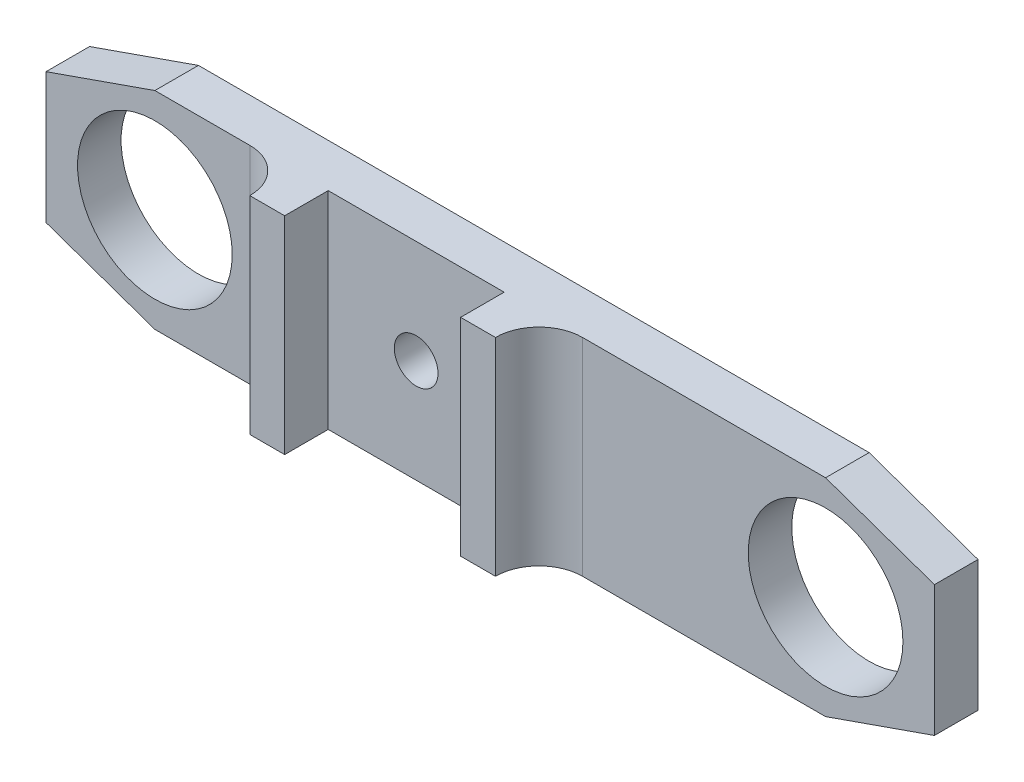
ISO-10303-21;
HEADER;
FILE_DESCRIPTION(('STEP AP214'),'2;1');
FILE_NAME('part.step','',(''),(''),'','','');
FILE_SCHEMA(('AUTOMOTIVE_DESIGN { 1 0 10303 214 1 1 1 1 }'));
ENDSEC;
DATA;
#1=APPLICATION_CONTEXT('core data for automotive mechanical design processes');
#2=APPLICATION_PROTOCOL_DEFINITION('international standard','automotive_design',2000,#1);
#3=PRODUCT_CONTEXT('',#1,'mechanical');
#4=PRODUCT('Part','Part','',(#3));
#5=PRODUCT_RELATED_PRODUCT_CATEGORY('part','',(#4));
#6=PRODUCT_DEFINITION_FORMATION('','',#4);
#7=PRODUCT_DEFINITION_CONTEXT('part definition',#1,'design');
#8=PRODUCT_DEFINITION('design','',#6,#7);
#9=PRODUCT_DEFINITION_SHAPE('','',#8);
#10=(LENGTH_UNIT() NAMED_UNIT(*) SI_UNIT(.MILLI.,.METRE.));
#11=(NAMED_UNIT(*) PLANE_ANGLE_UNIT() SI_UNIT($,.RADIAN.));
#12=(NAMED_UNIT(*) SI_UNIT($,.STERADIAN.) SOLID_ANGLE_UNIT());
#13=UNCERTAINTY_MEASURE_WITH_UNIT(LENGTH_MEASURE(1.E-05),#10,'distance_accuracy_value','');
#14=(GEOMETRIC_REPRESENTATION_CONTEXT(3) GLOBAL_UNCERTAINTY_ASSIGNED_CONTEXT((#13)) GLOBAL_UNIT_ASSIGNED_CONTEXT((#10,
#11,#12)) REPRESENTATION_CONTEXT('',''));
#15=CARTESIAN_POINT('',(0.,0.,0.));
#16=DIRECTION('',(0.,0.,1.));
#17=DIRECTION('',(1.,0.,0.));
#18=AXIS2_PLACEMENT_3D('',#15,#16,#17);
#19=CARTESIAN_POINT('',(0.,0.,6.35));
#20=DIRECTION('',(0.,0.,-1.));
#21=DIRECTION('',(-1.,0.,0.));
#22=AXIS2_PLACEMENT_3D('',#19,#20,#21);
#23=PLANE('',#22);
#24=CARTESIAN_POINT('',(0.,0.,6.35));
#25=DIRECTION('',(0.,0.,1.));
#26=DIRECTION('',(1.,0.,0.));
#27=AXIS2_PLACEMENT_3D('',#24,#25,#26);
#28=CIRCLE('',#27,3.1877);
#29=CARTESIAN_POINT('',(3.1877,0.,6.35));
#30=VERTEX_POINT('',#29);
#31=EDGE_CURVE('E258',#30,#30,#28,.T.);
#32=ORIENTED_EDGE('',*,*,#31,.F.);
#33=EDGE_LOOP('',(#32));
#34=FACE_BOUND('',#33,.T.);
#35=DIRECTION('',(0.,1.,0.));
#36=VECTOR('',#35,1.);
#37=CARTESIAN_POINT('',(-12.827,0.,6.35));
#38=LINE('',#37,#36);
#39=CARTESIAN_POINT('',(-12.827,-15.08125,6.35));
#40=VERTEX_POINT('',#39);
#41=CARTESIAN_POINT('',(-12.827,15.08125,6.35));
#42=VERTEX_POINT('',#41);
#43=EDGE_CURVE('E179',#40,#42,#38,.T.);
#44=ORIENTED_EDGE('',*,*,#43,.F.);
#45=DIRECTION('',(1.,0.,0.));
#46=VECTOR('',#45,1.);
#47=CARTESIAN_POINT('',(59.69,-15.08125,6.35));
#48=LINE('',#47,#46);
#49=CARTESIAN_POINT('',(12.827,-15.08125,6.35));
#50=VERTEX_POINT('',#49);
#51=EDGE_CURVE('E272',#40,#50,#48,.T.);
#52=ORIENTED_EDGE('',*,*,#51,.T.);
#53=DIRECTION('',(0.,1.,0.));
#54=VECTOR('',#53,1.);
#55=CARTESIAN_POINT('',(12.827,0.,6.35));
#56=LINE('',#55,#54);
#57=CARTESIAN_POINT('',(12.827,15.08125,6.35));
#58=VERTEX_POINT('',#57);
#59=EDGE_CURVE('E316',#50,#58,#56,.T.);
#60=ORIENTED_EDGE('',*,*,#59,.T.);
#61=DIRECTION('',(-1.,0.,0.));
#62=VECTOR('',#61,1.);
#63=CARTESIAN_POINT('',(-38.1,15.08125,6.35));
#64=LINE('',#63,#62);
#65=EDGE_CURVE('E259',#58,#42,#64,.T.);
#66=ORIENTED_EDGE('',*,*,#65,.T.);
#67=EDGE_LOOP('',(#44,#52,#60,#66));
#68=FACE_BOUND('',#67,.T.);
#69=ADVANCED_FACE('F44',(#34,#68),#23,.F.);
#70=CARTESIAN_POINT('',(59.69,0.,6.35));
#71=DIRECTION('',(0.,0.,1.));
#72=DIRECTION('',(1.,0.,0.));
#73=AXIS2_PLACEMENT_3D('',#70,#71,#72);
#74=CIRCLE('',#73,11.2776);
#75=CARTESIAN_POINT('',(70.9676,0.,6.35));
#76=VERTEX_POINT('',#75);
#77=EDGE_CURVE('E297',#76,#76,#74,.T.);
#78=ORIENTED_EDGE('',*,*,#77,.F.);
#79=EDGE_LOOP('',(#78));
#80=FACE_BOUND('',#79,.T.);
#81=CARTESIAN_POINT('',(59.69,15.08125,6.35));
#82=VERTEX_POINT('',#81);
#83=CARTESIAN_POINT('',(24.257,15.08125,6.35));
#84=VERTEX_POINT('',#83);
#85=EDGE_CURVE('E226',#82,#84,#64,.T.);
#86=ORIENTED_EDGE('',*,*,#85,.T.);
#87=DIRECTION('',(0.,1.,0.));
#88=VECTOR('',#87,1.);
#89=CARTESIAN_POINT('',(24.257,-15.08125,6.35));
#90=LINE('',#89,#88);
#91=CARTESIAN_POINT('',(24.257,-15.08125,6.35));
#92=VERTEX_POINT('',#91);
#93=EDGE_CURVE('E70',#84,#92,#90,.F.);
#94=ORIENTED_EDGE('',*,*,#93,.T.);
#95=CARTESIAN_POINT('',(59.69,-15.08125,6.35));
#96=VERTEX_POINT('',#95);
#97=EDGE_CURVE('E273',#92,#96,#48,.T.);
#98=ORIENTED_EDGE('',*,*,#97,.T.);
#99=DIRECTION('',(0.943858356366017,0.330350424728106,0.));
#100=VECTOR('',#99,1.);
#101=CARTESIAN_POINT('',(75.565,-9.525,6.35));
#102=LINE('',#101,#100);
#103=CARTESIAN_POINT('',(75.565,-9.525,6.35));
#104=VERTEX_POINT('',#103);
#105=EDGE_CURVE('E270',#96,#104,#102,.T.);
#106=ORIENTED_EDGE('',*,*,#105,.T.);
#107=DIRECTION('',(0.,1.,0.));
#108=VECTOR('',#107,1.);
#109=CARTESIAN_POINT('',(75.565,9.525,6.35));
#110=LINE('',#109,#108);
#111=CARTESIAN_POINT('',(75.565,9.525,6.35));
#112=VERTEX_POINT('',#111);
#113=EDGE_CURVE('E262',#104,#112,#110,.T.);
#114=ORIENTED_EDGE('',*,*,#113,.T.);
#115=DIRECTION('',(-0.943858356366017,0.330350424728106,0.));
#116=VECTOR('',#115,1.);
#117=CARTESIAN_POINT('',(59.69,15.08125,6.35));
#118=LINE('',#117,#116);
#119=EDGE_CURVE('E261',#112,#82,#118,.T.);
#120=ORIENTED_EDGE('',*,*,#119,.T.);
#121=EDGE_LOOP('',(#86,#94,#98,#106,#114,#120));
#122=FACE_BOUND('',#121,.T.);
#123=ADVANCED_FACE('F380',(#80,#122),#23,.F.);
#124=CARTESIAN_POINT('',(-38.1,-15.08125,6.35));
#125=VERTEX_POINT('',#124);
#126=CARTESIAN_POINT('',(-24.257,-15.08125,6.35));
#127=VERTEX_POINT('',#126);
#128=EDGE_CURVE('E269',#125,#127,#48,.T.);
#129=ORIENTED_EDGE('',*,*,#128,.T.);
#130=DIRECTION('',(0.,1.,0.));
#131=VECTOR('',#130,1.);
#132=CARTESIAN_POINT('',(-24.257,0.,6.35));
#133=LINE('',#132,#131);
#134=CARTESIAN_POINT('',(-24.257,15.08125,6.35));
#135=VERTEX_POINT('',#134);
#136=EDGE_CURVE('E183',#127,#135,#133,.T.);
#137=ORIENTED_EDGE('',*,*,#136,.T.);
#138=CARTESIAN_POINT('',(-38.1,15.08125,6.35));
#139=VERTEX_POINT('',#138);
#140=EDGE_CURVE('E257',#135,#139,#64,.T.);
#141=ORIENTED_EDGE('',*,*,#140,.T.);
#142=DIRECTION('',(-0.943858356366017,-0.330350424728106,0.));
#143=VECTOR('',#142,1.);
#144=CARTESIAN_POINT('',(-53.975,9.525,6.35));
#145=LINE('',#144,#143);
#146=CARTESIAN_POINT('',(-53.975,9.525,6.35));
#147=VERTEX_POINT('',#146);
#148=EDGE_CURVE('E231',#139,#147,#145,.T.);
#149=ORIENTED_EDGE('',*,*,#148,.T.);
#150=DIRECTION('',(0.,-1.,0.));
#151=VECTOR('',#150,1.);
#152=CARTESIAN_POINT('',(-53.975,-9.525,6.35));
#153=LINE('',#152,#151);
#154=CARTESIAN_POINT('',(-53.975,-9.525,6.35));
#155=VERTEX_POINT('',#154);
#156=EDGE_CURVE('E279',#147,#155,#153,.T.);
#157=ORIENTED_EDGE('',*,*,#156,.T.);
#158=DIRECTION('',(0.943858356366017,-0.330350424728106,0.));
#159=VECTOR('',#158,1.);
#160=CARTESIAN_POINT('',(-38.1,-15.08125,6.35));
#161=LINE('',#160,#159);
#162=EDGE_CURVE('E274',#155,#125,#161,.T.);
#163=ORIENTED_EDGE('',*,*,#162,.T.);
#164=EDGE_LOOP('',(#129,#137,#141,#149,#157,#163));
#165=FACE_BOUND('',#164,.T.);
#166=CARTESIAN_POINT('',(-38.1,0.,6.35));
#167=DIRECTION('',(0.,0.,1.));
#168=DIRECTION('',(1.,0.,0.));
#169=AXIS2_PLACEMENT_3D('',#166,#167,#168);
#170=CIRCLE('',#169,11.2776);
#171=CARTESIAN_POINT('',(-26.8224,0.,6.35));
#172=VERTEX_POINT('',#171);
#173=EDGE_CURVE('E286',#172,#172,#170,.T.);
#174=ORIENTED_EDGE('',*,*,#173,.F.);
#175=EDGE_LOOP('',(#174));
#176=FACE_BOUND('',#175,.T.);
#177=ADVANCED_FACE('F354',(#165,#176),#23,.F.);
#178=CARTESIAN_POINT('',(0.,0.,0.));
#179=DIRECTION('',(0.,0.,-1.));
#180=DIRECTION('',(-1.,0.,0.));
#181=AXIS2_PLACEMENT_3D('',#178,#179,#180);
#182=PLANE('',#181);
#183=CARTESIAN_POINT('',(-38.1,0.,0.));
#184=DIRECTION('',(0.,0.,1.));
#185=DIRECTION('',(1.,0.,0.));
#186=AXIS2_PLACEMENT_3D('',#183,#184,#185);
#187=CIRCLE('',#186,11.2776);
#188=CARTESIAN_POINT('',(-26.8224,0.,0.));
#189=VERTEX_POINT('',#188);
#190=EDGE_CURVE('E295',#189,#189,#187,.T.);
#191=ORIENTED_EDGE('',*,*,#190,.T.);
#192=EDGE_LOOP('',(#191));
#193=FACE_BOUND('',#192,.T.);
#194=DIRECTION('',(-0.943858356366017,-0.330350424728106,0.));
#195=VECTOR('',#194,1.);
#196=CARTESIAN_POINT('',(-53.975,9.525,0.));
#197=LINE('',#196,#195);
#198=CARTESIAN_POINT('',(-38.1,15.08125,0.));
#199=VERTEX_POINT('',#198);
#200=CARTESIAN_POINT('',(-53.975,9.525,0.));
#201=VERTEX_POINT('',#200);
#202=EDGE_CURVE('E252',#199,#201,#197,.T.);
#203=ORIENTED_EDGE('',*,*,#202,.F.);
#204=DIRECTION('',(-1.,0.,0.));
#205=VECTOR('',#204,1.);
#206=CARTESIAN_POINT('',(-38.1,15.08125,0.));
#207=LINE('',#206,#205);
#208=CARTESIAN_POINT('',(59.69,15.08125,0.));
#209=VERTEX_POINT('',#208);
#210=EDGE_CURVE('E228',#209,#199,#207,.T.);
#211=ORIENTED_EDGE('',*,*,#210,.F.);
#212=DIRECTION('',(-0.943858356366017,0.330350424728106,0.));
#213=VECTOR('',#212,1.);
#214=CARTESIAN_POINT('',(59.69,15.08125,0.));
#215=LINE('',#214,#213);
#216=CARTESIAN_POINT('',(75.565,9.525,0.));
#217=VERTEX_POINT('',#216);
#218=EDGE_CURVE('E232',#217,#209,#215,.T.);
#219=ORIENTED_EDGE('',*,*,#218,.F.);
#220=DIRECTION('',(0.,1.,0.));
#221=VECTOR('',#220,1.);
#222=CARTESIAN_POINT('',(75.565,9.525,0.));
#223=LINE('',#222,#221);
#224=CARTESIAN_POINT('',(75.565,-9.525,0.));
#225=VERTEX_POINT('',#224);
#226=EDGE_CURVE('E240',#225,#217,#223,.T.);
#227=ORIENTED_EDGE('',*,*,#226,.F.);
#228=DIRECTION('',(0.943858356366017,0.330350424728106,0.));
#229=VECTOR('',#228,1.);
#230=CARTESIAN_POINT('',(75.565,-9.525,0.));
#231=LINE('',#230,#229);
#232=CARTESIAN_POINT('',(59.69,-15.08125,0.));
#233=VERTEX_POINT('',#232);
#234=EDGE_CURVE('E238',#233,#225,#231,.T.);
#235=ORIENTED_EDGE('',*,*,#234,.F.);
#236=DIRECTION('',(1.,0.,0.));
#237=VECTOR('',#236,1.);
#238=CARTESIAN_POINT('',(59.69,-15.08125,0.));
#239=LINE('',#238,#237);
#240=CARTESIAN_POINT('',(-38.1,-15.08125,0.));
#241=VERTEX_POINT('',#240);
#242=EDGE_CURVE('E244',#241,#233,#239,.T.);
#243=ORIENTED_EDGE('',*,*,#242,.F.);
#244=DIRECTION('',(0.943858356366017,-0.330350424728106,0.));
#245=VECTOR('',#244,1.);
#246=CARTESIAN_POINT('',(-38.1,-15.08125,0.));
#247=LINE('',#246,#245);
#248=CARTESIAN_POINT('',(-53.975,-9.525,0.));
#249=VERTEX_POINT('',#248);
#250=EDGE_CURVE('E248',#249,#241,#247,.T.);
#251=ORIENTED_EDGE('',*,*,#250,.F.);
#252=DIRECTION('',(0.,-1.,0.));
#253=VECTOR('',#252,1.);
#254=CARTESIAN_POINT('',(-53.975,-9.525,0.));
#255=LINE('',#254,#253);
#256=EDGE_CURVE('E247',#201,#249,#255,.T.);
#257=ORIENTED_EDGE('',*,*,#256,.F.);
#258=EDGE_LOOP('',(#203,#211,#219,#227,#235,#243,#251,#257));
#259=FACE_BOUND('',#258,.T.);
#260=CARTESIAN_POINT('',(0.,0.,0.));
#261=DIRECTION('',(0.,0.,1.));
#262=DIRECTION('',(1.,0.,0.));
#263=AXIS2_PLACEMENT_3D('',#260,#261,#262);
#264=CIRCLE('',#263,3.1877);
#265=CARTESIAN_POINT('',(3.1877,0.,0.));
#266=VERTEX_POINT('',#265);
#267=EDGE_CURVE('E281',#266,#266,#264,.T.);
#268=ORIENTED_EDGE('',*,*,#267,.T.);
#269=EDGE_LOOP('',(#268));
#270=FACE_BOUND('',#269,.T.);
#271=CARTESIAN_POINT('',(59.69,0.,0.));
#272=DIRECTION('',(0.,0.,1.));
#273=DIRECTION('',(1.,0.,0.));
#274=AXIS2_PLACEMENT_3D('',#271,#272,#273);
#275=CIRCLE('',#274,11.2776);
#276=CARTESIAN_POINT('',(70.9676,0.,0.));
#277=VERTEX_POINT('',#276);
#278=EDGE_CURVE('E298',#277,#277,#275,.T.);
#279=ORIENTED_EDGE('',*,*,#278,.T.);
#280=EDGE_LOOP('',(#279));
#281=FACE_BOUND('',#280,.T.);
#282=ADVANCED_FACE('F365',(#193,#259,#270,#281),#182,.T.);
#283=CARTESIAN_POINT('',(-53.975,9.525,6.35));
#284=DIRECTION('',(0.330350424728106,-0.943858356366017,0.));
#285=DIRECTION('',(0.943858356366017,0.330350424728106,0.));
#286=AXIS2_PLACEMENT_3D('',#283,#284,#285);
#287=PLANE('',#286);
#288=ORIENTED_EDGE('',*,*,#202,.T.);
#289=DIRECTION('',(0.,0.,-1.));
#290=VECTOR('',#289,1.);
#291=CARTESIAN_POINT('',(-53.975,9.525,6.35));
#292=LINE('',#291,#290);
#293=EDGE_CURVE('E197',#147,#201,#292,.T.);
#294=ORIENTED_EDGE('',*,*,#293,.F.);
#295=ORIENTED_EDGE('',*,*,#148,.F.);
#296=DIRECTION('',(0.,0.,-1.));
#297=VECTOR('',#296,1.);
#298=CARTESIAN_POINT('',(-38.1,15.08125,6.35));
#299=LINE('',#298,#297);
#300=EDGE_CURVE('E223',#139,#199,#299,.T.);
#301=ORIENTED_EDGE('',*,*,#300,.T.);
#302=EDGE_LOOP('',(#288,#294,#295,#301));
#303=FACE_BOUND('',#302,.T.);
#304=ADVANCED_FACE('F418',(#303),#287,.F.);
#305=CARTESIAN_POINT('',(-53.975,-9.525,6.35));
#306=DIRECTION('',(1.,0.,0.));
#307=DIRECTION('',(0.,1.,0.));
#308=AXIS2_PLACEMENT_3D('',#305,#306,#307);
#309=PLANE('',#308);
#310=ORIENTED_EDGE('',*,*,#256,.T.);
#311=DIRECTION('',(0.,0.,-1.));
#312=VECTOR('',#311,1.);
#313=CARTESIAN_POINT('',(-53.975,-9.525,6.35));
#314=LINE('',#313,#312);
#315=EDGE_CURVE('E203',#155,#249,#314,.T.);
#316=ORIENTED_EDGE('',*,*,#315,.F.);
#317=ORIENTED_EDGE('',*,*,#156,.F.);
#318=ORIENTED_EDGE('',*,*,#293,.T.);
#319=EDGE_LOOP('',(#310,#316,#317,#318));
#320=FACE_BOUND('',#319,.T.);
#321=ADVANCED_FACE('F423',(#320),#309,.F.);
#322=CARTESIAN_POINT('',(-38.1,-15.08125,6.35));
#323=DIRECTION('',(0.330350424728106,0.943858356366017,0.));
#324=DIRECTION('',(-0.943858356366017,0.330350424728106,0.));
#325=AXIS2_PLACEMENT_3D('',#322,#323,#324);
#326=PLANE('',#325);
#327=ORIENTED_EDGE('',*,*,#250,.T.);
#328=DIRECTION('',(0.,0.,-1.));
#329=VECTOR('',#328,1.);
#330=CARTESIAN_POINT('',(-38.1,-15.08125,6.35));
#331=LINE('',#330,#329);
#332=EDGE_CURVE('E202',#125,#241,#331,.T.);
#333=ORIENTED_EDGE('',*,*,#332,.F.);
#334=ORIENTED_EDGE('',*,*,#162,.F.);
#335=ORIENTED_EDGE('',*,*,#315,.T.);
#336=EDGE_LOOP('',(#327,#333,#334,#335));
#337=FACE_BOUND('',#336,.T.);
#338=ADVANCED_FACE('F440',(#337),#326,.F.);
#339=CARTESIAN_POINT('',(59.69,-15.08125,6.35));
#340=DIRECTION('',(0.,1.,0.));
#341=DIRECTION('',(0.,0.,1.));
#342=AXIS2_PLACEMENT_3D('',#339,#340,#341);
#343=PLANE('',#342);
#344=ORIENTED_EDGE('',*,*,#242,.T.);
#345=DIRECTION('',(0.,0.,-1.));
#346=VECTOR('',#345,1.);
#347=CARTESIAN_POINT('',(59.69,-15.08125,6.35));
#348=LINE('',#347,#346);
#349=EDGE_CURVE('E207',#96,#233,#348,.T.);
#350=ORIENTED_EDGE('',*,*,#349,.F.);
#351=ORIENTED_EDGE('',*,*,#97,.F.);
#352=CARTESIAN_POINT('',(24.257,-15.08125,12.7));
#353=DIRECTION('',(0.,1.,0.));
#354=DIRECTION('',(0.,0.,1.));
#355=AXIS2_PLACEMENT_3D('',#352,#353,#354);
#356=CIRCLE('',#355,6.35);
#357=CARTESIAN_POINT('',(17.907,-15.08125,12.7));
#358=VERTEX_POINT('',#357);
#359=EDGE_CURVE('E11',#92,#358,#356,.T.);
#360=ORIENTED_EDGE('',*,*,#359,.T.);
#361=DIRECTION('',(1.,0.,0.));
#362=VECTOR('',#361,1.);
#363=CARTESIAN_POINT('',(0.,-15.08125,12.7));
#364=LINE('',#363,#362);
#365=CARTESIAN_POINT('',(12.827,-15.08125,12.7));
#366=VERTEX_POINT('',#365);
#367=EDGE_CURVE('E317',#366,#358,#364,.T.);
#368=ORIENTED_EDGE('',*,*,#367,.F.);
#369=DIRECTION('',(0.,0.,-1.));
#370=VECTOR('',#369,1.);
#371=CARTESIAN_POINT('',(12.827,-15.08125,12.7));
#372=LINE('',#371,#370);
#373=EDGE_CURVE('E313',#366,#50,#372,.T.);
#374=ORIENTED_EDGE('',*,*,#373,.T.);
#375=ORIENTED_EDGE('',*,*,#51,.F.);
#376=DIRECTION('',(0.,0.,-1.));
#377=VECTOR('',#376,1.);
#378=CARTESIAN_POINT('',(-12.827,-15.08125,12.7));
#379=LINE('',#378,#377);
#380=CARTESIAN_POINT('',(-12.827,-15.08125,12.7));
#381=VERTEX_POINT('',#380);
#382=EDGE_CURVE('E167',#381,#40,#379,.T.);
#383=ORIENTED_EDGE('',*,*,#382,.F.);
#384=DIRECTION('',(1.,0.,0.));
#385=VECTOR('',#384,1.);
#386=CARTESIAN_POINT('',(0.,-15.08125,12.7));
#387=LINE('',#386,#385);
#388=CARTESIAN_POINT('',(-17.907,-15.08125,12.7));
#389=VERTEX_POINT('',#388);
#390=EDGE_CURVE('E160',#389,#381,#387,.T.);
#391=ORIENTED_EDGE('',*,*,#390,.F.);
#392=CARTESIAN_POINT('',(-24.257,-15.08125,12.7));
#393=DIRECTION('',(0.,1.,0.));
#394=DIRECTION('',(0.,0.,1.));
#395=AXIS2_PLACEMENT_3D('',#392,#393,#394);
#396=CIRCLE('',#395,6.35);
#397=EDGE_CURVE('E165',#389,#127,#396,.T.);
#398=ORIENTED_EDGE('',*,*,#397,.T.);
#399=ORIENTED_EDGE('',*,*,#128,.F.);
#400=ORIENTED_EDGE('',*,*,#332,.T.);
#401=EDGE_LOOP('',(#344,#350,#351,#360,#368,#374,#375,#383,#391,#398,#399,#400));
#402=FACE_BOUND('',#401,.T.);
#403=ADVANCED_FACE('F157',(#402),#343,.F.);
#404=CARTESIAN_POINT('',(75.565,-9.525,6.35));
#405=DIRECTION('',(-0.330350424728106,0.943858356366017,0.));
#406=DIRECTION('',(-0.943858356366017,-0.330350424728106,0.));
#407=AXIS2_PLACEMENT_3D('',#404,#405,#406);
#408=PLANE('',#407);
#409=ORIENTED_EDGE('',*,*,#234,.T.);
#410=DIRECTION('',(0.,0.,-1.));
#411=VECTOR('',#410,1.);
#412=CARTESIAN_POINT('',(75.565,-9.525,6.35));
#413=LINE('',#412,#411);
#414=EDGE_CURVE('E213',#104,#225,#413,.T.);
#415=ORIENTED_EDGE('',*,*,#414,.F.);
#416=ORIENTED_EDGE('',*,*,#105,.F.);
#417=ORIENTED_EDGE('',*,*,#349,.T.);
#418=EDGE_LOOP('',(#409,#415,#416,#417));
#419=FACE_BOUND('',#418,.T.);
#420=ADVANCED_FACE('F367',(#419),#408,.F.);
#421=CARTESIAN_POINT('',(75.565,9.525,6.35));
#422=DIRECTION('',(-1.,0.,0.));
#423=DIRECTION('',(0.,-1.,0.));
#424=AXIS2_PLACEMENT_3D('',#421,#422,#423);
#425=PLANE('',#424);
#426=ORIENTED_EDGE('',*,*,#226,.T.);
#427=DIRECTION('',(0.,0.,-1.));
#428=VECTOR('',#427,1.);
#429=CARTESIAN_POINT('',(75.565,9.525,6.35));
#430=LINE('',#429,#428);
#431=EDGE_CURVE('E220',#112,#217,#430,.T.);
#432=ORIENTED_EDGE('',*,*,#431,.F.);
#433=ORIENTED_EDGE('',*,*,#113,.F.);
#434=ORIENTED_EDGE('',*,*,#414,.T.);
#435=EDGE_LOOP('',(#426,#432,#433,#434));
#436=FACE_BOUND('',#435,.T.);
#437=ADVANCED_FACE('F372',(#436),#425,.F.);
#438=CARTESIAN_POINT('',(59.69,15.08125,6.35));
#439=DIRECTION('',(-0.330350424728106,-0.943858356366017,0.));
#440=DIRECTION('',(0.943858356366017,-0.330350424728106,0.));
#441=AXIS2_PLACEMENT_3D('',#438,#439,#440);
#442=PLANE('',#441);
#443=ORIENTED_EDGE('',*,*,#218,.T.);
#444=DIRECTION('',(0.,0.,-1.));
#445=VECTOR('',#444,1.);
#446=CARTESIAN_POINT('',(59.69,15.08125,6.35));
#447=LINE('',#446,#445);
#448=EDGE_CURVE('E222',#82,#209,#447,.T.);
#449=ORIENTED_EDGE('',*,*,#448,.F.);
#450=ORIENTED_EDGE('',*,*,#119,.F.);
#451=ORIENTED_EDGE('',*,*,#431,.T.);
#452=EDGE_LOOP('',(#443,#449,#450,#451));
#453=FACE_BOUND('',#452,.T.);
#454=ADVANCED_FACE('F428',(#453),#442,.F.);
#455=CARTESIAN_POINT('',(-38.1,15.08125,6.35));
#456=DIRECTION('',(0.,-1.,0.));
#457=DIRECTION('',(1.,0.,0.));
#458=AXIS2_PLACEMENT_3D('',#455,#456,#457);
#459=PLANE('',#458);
#460=ORIENTED_EDGE('',*,*,#210,.T.);
#461=ORIENTED_EDGE('',*,*,#300,.F.);
#462=ORIENTED_EDGE('',*,*,#140,.F.);
#463=CARTESIAN_POINT('',(-24.257,15.08125,12.7));
#464=DIRECTION('',(0.,-1.,0.));
#465=DIRECTION('',(1.,0.,0.));
#466=AXIS2_PLACEMENT_3D('',#463,#464,#465);
#467=CIRCLE('',#466,6.35);
#468=CARTESIAN_POINT('',(-17.907,15.08125,12.7));
#469=VERTEX_POINT('',#468);
#470=EDGE_CURVE('E190',#135,#469,#467,.T.);
#471=ORIENTED_EDGE('',*,*,#470,.T.);
#472=DIRECTION('',(-1.,0.,0.));
#473=VECTOR('',#472,1.);
#474=CARTESIAN_POINT('',(0.,15.08125,12.7));
#475=LINE('',#474,#473);
#476=CARTESIAN_POINT('',(-12.827,15.08125,12.7));
#477=VERTEX_POINT('',#476);
#478=EDGE_CURVE('E180',#477,#469,#475,.T.);
#479=ORIENTED_EDGE('',*,*,#478,.F.);
#480=DIRECTION('',(0.,0.,-1.));
#481=VECTOR('',#480,1.);
#482=CARTESIAN_POINT('',(-12.827,15.08125,12.7));
#483=LINE('',#482,#481);
#484=EDGE_CURVE('E333',#477,#42,#483,.T.);
#485=ORIENTED_EDGE('',*,*,#484,.T.);
#486=ORIENTED_EDGE('',*,*,#65,.F.);
#487=DIRECTION('',(0.,0.,-1.));
#488=VECTOR('',#487,1.);
#489=CARTESIAN_POINT('',(12.827,15.08125,12.7));
#490=LINE('',#489,#488);
#491=CARTESIAN_POINT('',(12.827,15.08125,12.7));
#492=VERTEX_POINT('',#491);
#493=EDGE_CURVE('E307',#492,#58,#490,.T.);
#494=ORIENTED_EDGE('',*,*,#493,.F.);
#495=DIRECTION('',(-1.,0.,0.));
#496=VECTOR('',#495,1.);
#497=CARTESIAN_POINT('',(0.,15.08125,12.7));
#498=LINE('',#497,#496);
#499=CARTESIAN_POINT('',(17.907,15.08125,12.7));
#500=VERTEX_POINT('',#499);
#501=EDGE_CURVE('E323',#500,#492,#498,.T.);
#502=ORIENTED_EDGE('',*,*,#501,.F.);
#503=CARTESIAN_POINT('',(24.257,15.08125,12.7));
#504=DIRECTION('',(0.,-1.,0.));
#505=DIRECTION('',(1.,0.,0.));
#506=AXIS2_PLACEMENT_3D('',#503,#504,#505);
#507=CIRCLE('',#506,6.35);
#508=EDGE_CURVE('E53',#500,#84,#507,.T.);
#509=ORIENTED_EDGE('',*,*,#508,.T.);
#510=ORIENTED_EDGE('',*,*,#85,.F.);
#511=ORIENTED_EDGE('',*,*,#448,.T.);
#512=EDGE_LOOP('',(#460,#461,#462,#471,#479,#485,#486,#494,#502,#509,#510,#511));
#513=FACE_BOUND('',#512,.T.);
#514=ADVANCED_FACE('F349',(#513),#459,.F.);
#515=CARTESIAN_POINT('',(0.,0.,6.35));
#516=DIRECTION('',(0.,0.,-1.));
#517=DIRECTION('',(-1.,0.,0.));
#518=AXIS2_PLACEMENT_3D('',#515,#516,#517);
#519=CYLINDRICAL_SURFACE('',#518,3.1877);
#520=ORIENTED_EDGE('',*,*,#31,.T.);
#521=EDGE_LOOP('',(#520));
#522=FACE_BOUND('',#521,.T.);
#523=ORIENTED_EDGE('',*,*,#267,.F.);
#524=EDGE_LOOP('',(#523));
#525=FACE_BOUND('',#524,.T.);
#526=ADVANCED_FACE('F430',(#522,#525),#519,.F.);
#527=CARTESIAN_POINT('',(-38.1,0.,6.35));
#528=DIRECTION('',(0.,0.,-1.));
#529=DIRECTION('',(-1.,0.,0.));
#530=AXIS2_PLACEMENT_3D('',#527,#528,#529);
#531=CYLINDRICAL_SURFACE('',#530,11.2776);
#532=ORIENTED_EDGE('',*,*,#173,.T.);
#533=EDGE_LOOP('',(#532));
#534=FACE_BOUND('',#533,.T.);
#535=ORIENTED_EDGE('',*,*,#190,.F.);
#536=EDGE_LOOP('',(#535));
#537=FACE_BOUND('',#536,.T.);
#538=ADVANCED_FACE('F479',(#534,#537),#531,.F.);
#539=CARTESIAN_POINT('',(59.69,0.,6.35));
#540=DIRECTION('',(0.,0.,-1.));
#541=DIRECTION('',(-1.,0.,0.));
#542=AXIS2_PLACEMENT_3D('',#539,#540,#541);
#543=CYLINDRICAL_SURFACE('',#542,11.2776);
#544=ORIENTED_EDGE('',*,*,#77,.T.);
#545=EDGE_LOOP('',(#544));
#546=FACE_BOUND('',#545,.T.);
#547=ORIENTED_EDGE('',*,*,#278,.F.);
#548=EDGE_LOOP('',(#547));
#549=FACE_BOUND('',#548,.T.);
#550=ADVANCED_FACE('F486',(#546,#549),#543,.F.);
#551=CARTESIAN_POINT('',(12.827,0.,12.7));
#552=DIRECTION('',(-1.,0.,0.));
#553=DIRECTION('',(0.,0.,1.));
#554=AXIS2_PLACEMENT_3D('',#551,#552,#553);
#555=PLANE('',#554);
#556=ORIENTED_EDGE('',*,*,#59,.F.);
#557=ORIENTED_EDGE('',*,*,#373,.F.);
#558=DIRECTION('',(0.,1.,0.));
#559=VECTOR('',#558,1.);
#560=CARTESIAN_POINT('',(12.827,0.,12.7));
#561=LINE('',#560,#559);
#562=EDGE_CURVE('E312',#366,#492,#561,.T.);
#563=ORIENTED_EDGE('',*,*,#562,.T.);
#564=ORIENTED_EDGE('',*,*,#493,.T.);
#565=EDGE_LOOP('',(#556,#557,#563,#564));
#566=FACE_BOUND('',#565,.T.);
#567=ADVANCED_FACE('F390',(#566),#555,.T.);
#568=CARTESIAN_POINT('',(0.,0.,12.7));
#569=DIRECTION('',(0.,0.,1.));
#570=DIRECTION('',(1.,0.,0.));
#571=AXIS2_PLACEMENT_3D('',#568,#569,#570);
#572=PLANE('',#571);
#573=ORIENTED_EDGE('',*,*,#367,.T.);
#574=DIRECTION('',(0.,1.,0.));
#575=VECTOR('',#574,1.);
#576=CARTESIAN_POINT('',(17.907,0.,12.7));
#577=LINE('',#576,#575);
#578=EDGE_CURVE('E326',#358,#500,#577,.T.);
#579=ORIENTED_EDGE('',*,*,#578,.T.);
#580=ORIENTED_EDGE('',*,*,#501,.T.);
#581=ORIENTED_EDGE('',*,*,#562,.F.);
#582=EDGE_LOOP('',(#573,#579,#580,#581));
#583=FACE_BOUND('',#582,.T.);
#584=ADVANCED_FACE('F395',(#583),#572,.T.);
#585=CARTESIAN_POINT('',(-12.827,0.,12.7));
#586=DIRECTION('',(-1.,0.,0.));
#587=DIRECTION('',(0.,0.,1.));
#588=AXIS2_PLACEMENT_3D('',#585,#586,#587);
#589=PLANE('',#588);
#590=ORIENTED_EDGE('',*,*,#43,.T.);
#591=ORIENTED_EDGE('',*,*,#484,.F.);
#592=DIRECTION('',(0.,1.,0.));
#593=VECTOR('',#592,1.);
#594=CARTESIAN_POINT('',(-12.827,0.,12.7));
#595=LINE('',#594,#593);
#596=EDGE_CURVE('E168',#381,#477,#595,.T.);
#597=ORIENTED_EDGE('',*,*,#596,.F.);
#598=ORIENTED_EDGE('',*,*,#382,.T.);
#599=EDGE_LOOP('',(#590,#591,#597,#598));
#600=FACE_BOUND('',#599,.T.);
#601=ADVANCED_FACE('F350',(#600),#589,.F.);
#602=CARTESIAN_POINT('',(0.,0.,12.7));
#603=DIRECTION('',(0.,0.,1.));
#604=DIRECTION('',(1.,0.,0.));
#605=AXIS2_PLACEMENT_3D('',#602,#603,#604);
#606=PLANE('',#605);
#607=DIRECTION('',(0.,1.,0.));
#608=VECTOR('',#607,1.);
#609=CARTESIAN_POINT('',(-17.907,0.,12.7));
#610=LINE('',#609,#608);
#611=EDGE_CURVE('E172',#389,#469,#610,.T.);
#612=ORIENTED_EDGE('',*,*,#611,.F.);
#613=ORIENTED_EDGE('',*,*,#390,.T.);
#614=ORIENTED_EDGE('',*,*,#596,.T.);
#615=ORIENTED_EDGE('',*,*,#478,.T.);
#616=EDGE_LOOP('',(#612,#613,#614,#615));
#617=FACE_BOUND('',#616,.T.);
#618=ADVANCED_FACE('F173',(#617),#606,.T.);
#619=CARTESIAN_POINT('',(-24.257,0.,12.7));
#620=DIRECTION('',(0.,1.,0.));
#621=DIRECTION('',(0.,0.,1.));
#622=AXIS2_PLACEMENT_3D('',#619,#620,#621);
#623=CYLINDRICAL_SURFACE('',#622,6.35);
#624=ORIENTED_EDGE('',*,*,#397,.F.);
#625=ORIENTED_EDGE('',*,*,#611,.T.);
#626=ORIENTED_EDGE('',*,*,#470,.F.);
#627=ORIENTED_EDGE('',*,*,#136,.F.);
#628=EDGE_LOOP('',(#624,#625,#626,#627));
#629=FACE_BOUND('',#628,.T.);
#630=ADVANCED_FACE('F181',(#629),#623,.F.);
#631=CARTESIAN_POINT('',(24.257,0.,12.7));
#632=DIRECTION('',(0.,-1.,0.));
#633=DIRECTION('',(0.,0.,-1.));
#634=AXIS2_PLACEMENT_3D('',#631,#632,#633);
#635=CYLINDRICAL_SURFACE('',#634,6.35);
#636=ORIENTED_EDGE('',*,*,#359,.F.);
#637=ORIENTED_EDGE('',*,*,#93,.F.);
#638=ORIENTED_EDGE('',*,*,#508,.F.);
#639=ORIENTED_EDGE('',*,*,#578,.F.);
#640=EDGE_LOOP('',(#636,#637,#638,#639));
#641=FACE_BOUND('',#640,.T.);
#642=ADVANCED_FACE('F50',(#641),#635,.F.);
#643=CLOSED_SHELL('',(#69,#123,#177,#282,#304,#321,#338,#403,#420,#437,#454,#514,#526,#538,#550,
#567,#584,#601,#618,#630,#642));
#644=MANIFOLD_SOLID_BREP('B2',#643);
#645=ADVANCED_BREP_SHAPE_REPRESENTATION('',(#18,#644),#14);
#646=SHAPE_DEFINITION_REPRESENTATION(#9,#645);
ENDSEC;
END-ISO-10303-21;
